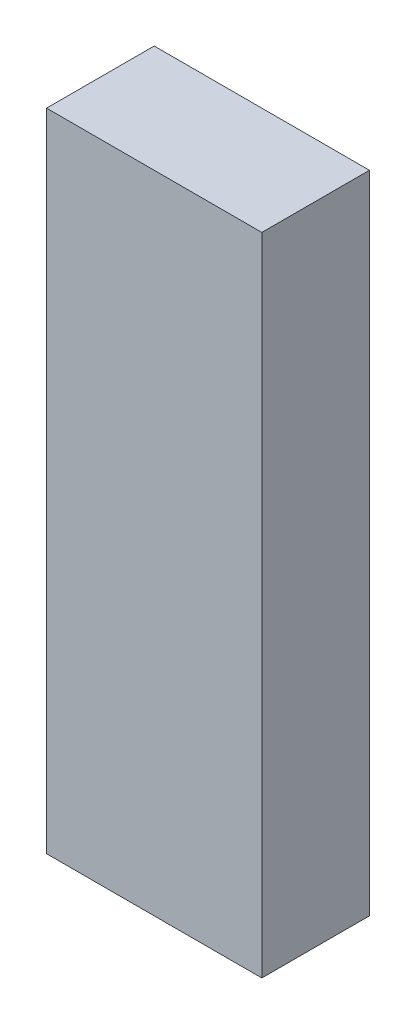
ISO-10303-21;
HEADER;
FILE_DESCRIPTION(('STEP AP214'),'2;1');
FILE_NAME('part.step','',(''),(''),'','','');
FILE_SCHEMA(('AUTOMOTIVE_DESIGN { 1 0 10303 214 1 1 1 1 }'));
ENDSEC;
DATA;
#1=APPLICATION_CONTEXT('core data for automotive mechanical design processes');
#2=APPLICATION_PROTOCOL_DEFINITION('international standard','automotive_design',2000,#1);
#3=PRODUCT_CONTEXT('',#1,'mechanical');
#4=PRODUCT('Part','Part','',(#3));
#5=PRODUCT_RELATED_PRODUCT_CATEGORY('part','',(#4));
#6=PRODUCT_DEFINITION_FORMATION('','',#4);
#7=PRODUCT_DEFINITION_CONTEXT('part definition',#1,'design');
#8=PRODUCT_DEFINITION('design','',#6,#7);
#9=PRODUCT_DEFINITION_SHAPE('','',#8);
#10=(LENGTH_UNIT() NAMED_UNIT(*) SI_UNIT(.MILLI.,.METRE.));
#11=(NAMED_UNIT(*) PLANE_ANGLE_UNIT() SI_UNIT($,.RADIAN.));
#12=(NAMED_UNIT(*) SI_UNIT($,.STERADIAN.) SOLID_ANGLE_UNIT());
#13=UNCERTAINTY_MEASURE_WITH_UNIT(LENGTH_MEASURE(1.E-05),#10,'distance_accuracy_value','');
#14=(GEOMETRIC_REPRESENTATION_CONTEXT(3) GLOBAL_UNCERTAINTY_ASSIGNED_CONTEXT((#13)) GLOBAL_UNIT_ASSIGNED_CONTEXT((#10,
#11,#12)) REPRESENTATION_CONTEXT('',''));
#15=CARTESIAN_POINT('',(0.,0.,0.));
#16=DIRECTION('',(0.,0.,1.));
#17=DIRECTION('',(1.,0.,0.));
#18=AXIS2_PLACEMENT_3D('',#15,#16,#17);
#19=CARTESIAN_POINT('',(-59.3140572985169,304.8,-37.2508698950893));
#20=DIRECTION('',(1.,0.,0.));
#21=DIRECTION('',(0.,0.,-1.));
#22=AXIS2_PLACEMENT_3D('',#19,#20,#21);
#23=PLANE('',#22);
#24=DIRECTION('',(0.,0.,1.));
#25=VECTOR('',#24,1.);
#26=CARTESIAN_POINT('',(-59.3140572985169,0.,-37.2508698950893));
#27=LINE('',#26,#25);
#28=CARTESIAN_POINT('',(-59.3140572985169,0.,-37.2508698950893));
#29=VERTEX_POINT('',#28);
#30=CARTESIAN_POINT('',(-59.3140572985169,0.,13.5491301049107));
#31=VERTEX_POINT('',#30);
#32=EDGE_CURVE('E94',#29,#31,#27,.T.);
#33=ORIENTED_EDGE('',*,*,#32,.T.);
#34=DIRECTION('',(0.,-1.,0.));
#35=VECTOR('',#34,1.);
#36=CARTESIAN_POINT('',(-59.3140572985169,304.8,13.5491301049107));
#37=LINE('',#36,#35);
#38=CARTESIAN_POINT('',(-59.3140572985169,304.8,13.5491301049107));
#39=VERTEX_POINT('',#38);
#40=EDGE_CURVE('E11',#39,#31,#37,.T.);
#41=ORIENTED_EDGE('',*,*,#40,.F.);
#42=DIRECTION('',(0.,0.,1.));
#43=VECTOR('',#42,1.);
#44=CARTESIAN_POINT('',(-59.3140572985169,304.8,-37.2508698950893));
#45=LINE('',#44,#43);
#46=CARTESIAN_POINT('',(-59.3140572985169,304.8,-37.2508698950893));
#47=VERTEX_POINT('',#46);
#48=EDGE_CURVE('E82',#47,#39,#45,.T.);
#49=ORIENTED_EDGE('',*,*,#48,.F.);
#50=DIRECTION('',(0.,-1.,0.));
#51=VECTOR('',#50,1.);
#52=CARTESIAN_POINT('',(-59.3140572985169,304.8,-37.2508698950893));
#53=LINE('',#52,#51);
#54=EDGE_CURVE('E90',#47,#29,#53,.T.);
#55=ORIENTED_EDGE('',*,*,#54,.T.);
#56=EDGE_LOOP('',(#33,#41,#49,#55));
#57=FACE_BOUND('',#56,.T.);
#58=ADVANCED_FACE('F31',(#57),#23,.F.);
#59=CARTESIAN_POINT('',(-59.3140572985169,304.8,13.5491301049107));
#60=DIRECTION('',(0.,0.,-1.));
#61=DIRECTION('',(-1.,0.,0.));
#62=AXIS2_PLACEMENT_3D('',#59,#60,#61);
#63=PLANE('',#62);
#64=DIRECTION('',(1.,0.,0.));
#65=VECTOR('',#64,1.);
#66=CARTESIAN_POINT('',(-59.3140572985169,0.,13.5491301049107));
#67=LINE('',#66,#65);
#68=CARTESIAN_POINT('',(42.2859427014831,0.,13.5491301049107));
#69=VERTEX_POINT('',#68);
#70=EDGE_CURVE('E86',#31,#69,#67,.T.);
#71=ORIENTED_EDGE('',*,*,#70,.T.);
#72=DIRECTION('',(0.,-1.,0.));
#73=VECTOR('',#72,1.);
#74=CARTESIAN_POINT('',(42.2859427014831,304.8,13.5491301049107));
#75=LINE('',#74,#73);
#76=CARTESIAN_POINT('',(42.2859427014831,304.8,13.5491301049107));
#77=VERTEX_POINT('',#76);
#78=EDGE_CURVE('E39',#77,#69,#75,.T.);
#79=ORIENTED_EDGE('',*,*,#78,.F.);
#80=DIRECTION('',(1.,0.,0.));
#81=VECTOR('',#80,1.);
#82=CARTESIAN_POINT('',(-59.3140572985169,304.8,13.5491301049107));
#83=LINE('',#82,#81);
#84=EDGE_CURVE('E77',#39,#77,#83,.T.);
#85=ORIENTED_EDGE('',*,*,#84,.F.);
#86=ORIENTED_EDGE('',*,*,#40,.T.);
#87=EDGE_LOOP('',(#71,#79,#85,#86));
#88=FACE_BOUND('',#87,.T.);
#89=ADVANCED_FACE('F85',(#88),#63,.F.);
#90=CARTESIAN_POINT('',(42.2859427014831,304.8,-37.2508698950893));
#91=DIRECTION('',(-1.,0.,0.));
#92=DIRECTION('',(0.,0.,1.));
#93=AXIS2_PLACEMENT_3D('',#90,#91,#92);
#94=PLANE('',#93);
#95=DIRECTION('',(0.,0.,-1.));
#96=VECTOR('',#95,1.);
#97=CARTESIAN_POINT('',(42.2859427014831,0.,-37.2508698950893));
#98=LINE('',#97,#96);
#99=CARTESIAN_POINT('',(42.2859427014831,0.,-37.2508698950893));
#100=VERTEX_POINT('',#99);
#101=EDGE_CURVE('E64',#69,#100,#98,.T.);
#102=ORIENTED_EDGE('',*,*,#101,.T.);
#103=DIRECTION('',(0.,-1.,0.));
#104=VECTOR('',#103,1.);
#105=CARTESIAN_POINT('',(42.2859427014831,304.8,-37.2508698950893));
#106=LINE('',#105,#104);
#107=CARTESIAN_POINT('',(42.2859427014831,304.8,-37.2508698950893));
#108=VERTEX_POINT('',#107);
#109=EDGE_CURVE('E87',#108,#100,#106,.T.);
#110=ORIENTED_EDGE('',*,*,#109,.F.);
#111=DIRECTION('',(0.,0.,-1.));
#112=VECTOR('',#111,1.);
#113=CARTESIAN_POINT('',(42.2859427014831,304.8,-37.2508698950893));
#114=LINE('',#113,#112);
#115=EDGE_CURVE('E80',#77,#108,#114,.T.);
#116=ORIENTED_EDGE('',*,*,#115,.F.);
#117=ORIENTED_EDGE('',*,*,#78,.T.);
#118=EDGE_LOOP('',(#102,#110,#116,#117));
#119=FACE_BOUND('',#118,.T.);
#120=ADVANCED_FACE('F88',(#119),#94,.F.);
#121=CARTESIAN_POINT('',(-59.3140572985169,304.8,-37.2508698950893));
#122=DIRECTION('',(0.,0.,1.));
#123=DIRECTION('',(1.,0.,0.));
#124=AXIS2_PLACEMENT_3D('',#121,#122,#123);
#125=PLANE('',#124);
#126=DIRECTION('',(-1.,0.,0.));
#127=VECTOR('',#126,1.);
#128=CARTESIAN_POINT('',(-59.3140572985169,0.,-37.2508698950893));
#129=LINE('',#128,#127);
#130=EDGE_CURVE('E70',#100,#29,#129,.T.);
#131=ORIENTED_EDGE('',*,*,#130,.T.);
#132=ORIENTED_EDGE('',*,*,#54,.F.);
#133=DIRECTION('',(-1.,0.,0.));
#134=VECTOR('',#133,1.);
#135=CARTESIAN_POINT('',(-59.3140572985169,304.8,-37.2508698950893));
#136=LINE('',#135,#134);
#137=EDGE_CURVE('E47',#108,#47,#136,.T.);
#138=ORIENTED_EDGE('',*,*,#137,.F.);
#139=ORIENTED_EDGE('',*,*,#109,.T.);
#140=EDGE_LOOP('',(#131,#132,#138,#139));
#141=FACE_BOUND('',#140,.T.);
#142=ADVANCED_FACE('F101',(#141),#125,.F.);
#143=CARTESIAN_POINT('',(-59.3140572985169,304.8,13.5491301049107));
#144=DIRECTION('',(0.,1.,0.));
#145=DIRECTION('',(0.,0.,1.));
#146=AXIS2_PLACEMENT_3D('',#143,#144,#145);
#147=PLANE('',#146);
#148=ORIENTED_EDGE('',*,*,#48,.T.);
#149=ORIENTED_EDGE('',*,*,#84,.T.);
#150=ORIENTED_EDGE('',*,*,#115,.T.);
#151=ORIENTED_EDGE('',*,*,#137,.T.);
#152=EDGE_LOOP('',(#148,#149,#150,#151));
#153=FACE_BOUND('',#152,.T.);
#154=ADVANCED_FACE('F78',(#153),#147,.T.);
#155=CARTESIAN_POINT('',(-59.3140572985169,0.,13.5491301049107));
#156=DIRECTION('',(0.,1.,0.));
#157=DIRECTION('',(0.,0.,1.));
#158=AXIS2_PLACEMENT_3D('',#155,#156,#157);
#159=PLANE('',#158);
#160=ORIENTED_EDGE('',*,*,#32,.F.);
#161=ORIENTED_EDGE('',*,*,#130,.F.);
#162=ORIENTED_EDGE('',*,*,#101,.F.);
#163=ORIENTED_EDGE('',*,*,#70,.F.);
#164=EDGE_LOOP('',(#160,#161,#162,#163));
#165=FACE_BOUND('',#164,.T.);
#166=ADVANCED_FACE('F104',(#165),#159,.F.);
#167=CLOSED_SHELL('',(#58,#89,#120,#142,#154,#166));
#168=MANIFOLD_SOLID_BREP('B2',#167);
#169=ADVANCED_BREP_SHAPE_REPRESENTATION('',(#18,#168),#14);
#170=SHAPE_DEFINITION_REPRESENTATION(#9,#169);
ENDSEC;
END-ISO-10303-21;
